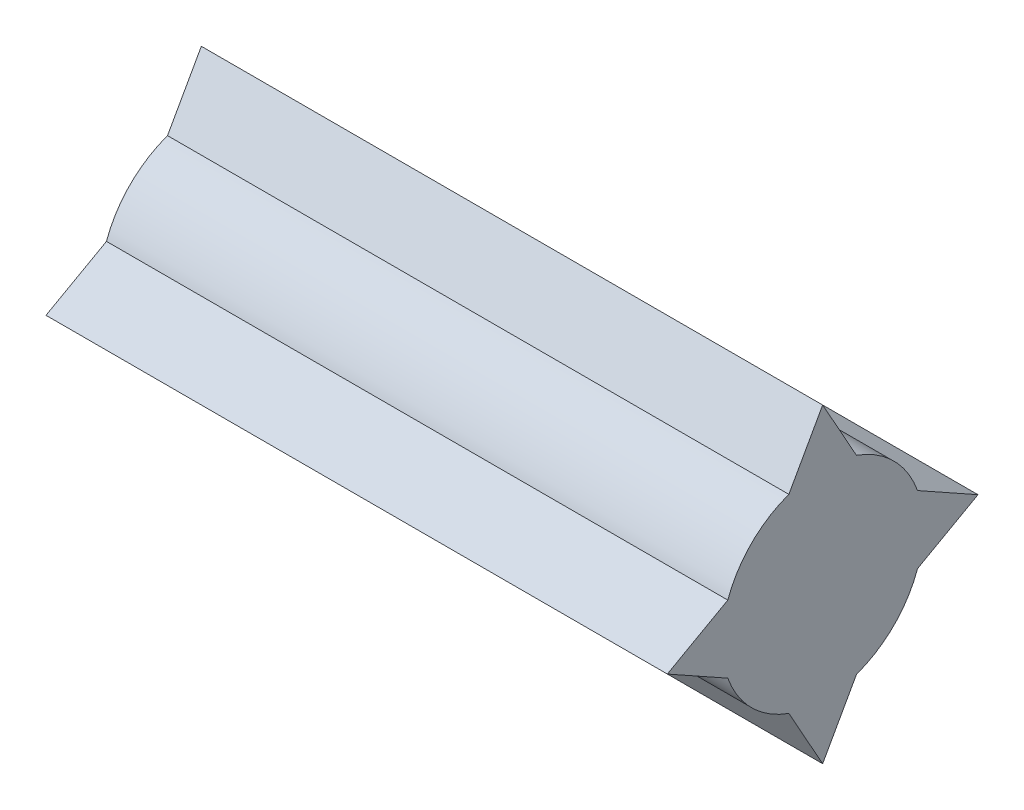
ISO-10303-21;
HEADER;
FILE_DESCRIPTION(('STEP AP214'),'2;1');
FILE_NAME('part.step','',(''),(''),'','','');
FILE_SCHEMA(('AUTOMOTIVE_DESIGN { 1 0 10303 214 1 1 1 1 }'));
ENDSEC;
DATA;
#1=APPLICATION_CONTEXT('core data for automotive mechanical design processes');
#2=APPLICATION_PROTOCOL_DEFINITION('international standard','automotive_design',2000,#1);
#3=PRODUCT_CONTEXT('',#1,'mechanical');
#4=PRODUCT('Part','Part','',(#3));
#5=PRODUCT_RELATED_PRODUCT_CATEGORY('part','',(#4));
#6=PRODUCT_DEFINITION_FORMATION('','',#4);
#7=PRODUCT_DEFINITION_CONTEXT('part definition',#1,'design');
#8=PRODUCT_DEFINITION('design','',#6,#7);
#9=PRODUCT_DEFINITION_SHAPE('','',#8);
#10=(LENGTH_UNIT() NAMED_UNIT(*) SI_UNIT(.MILLI.,.METRE.));
#11=(NAMED_UNIT(*) PLANE_ANGLE_UNIT() SI_UNIT($,.RADIAN.));
#12=(NAMED_UNIT(*) SI_UNIT($,.STERADIAN.) SOLID_ANGLE_UNIT());
#13=UNCERTAINTY_MEASURE_WITH_UNIT(LENGTH_MEASURE(1.E-05),#10,'distance_accuracy_value','');
#14=(GEOMETRIC_REPRESENTATION_CONTEXT(3) GLOBAL_UNCERTAINTY_ASSIGNED_CONTEXT((#13)) GLOBAL_UNIT_ASSIGNED_CONTEXT((#10,
#11,#12)) REPRESENTATION_CONTEXT('',''));
#15=CARTESIAN_POINT('',(0.,0.,0.));
#16=DIRECTION('',(0.,0.,1.));
#17=DIRECTION('',(1.,0.,0.));
#18=AXIS2_PLACEMENT_3D('',#15,#16,#17);
#19=CARTESIAN_POINT('',(15.,0.,0.));
#20=DIRECTION('',(1.,0.,0.));
#21=DIRECTION('',(0.,0.,-1.));
#22=AXIS2_PLACEMENT_3D('',#19,#20,#21);
#23=PLANE('',#22);
#24=CARTESIAN_POINT('',(15.,0.,0.));
#25=DIRECTION('',(1.,0.,0.));
#26=DIRECTION('',(0.,0.,-1.));
#27=AXIS2_PLACEMENT_3D('',#24,#25,#26);
#28=CIRCLE('',#27,4.8625);
#29=CARTESIAN_POINT('',(15.,-1.63235290016241,-4.58031988613583));
#30=VERTEX_POINT('',#29);
#31=CARTESIAN_POINT('',(15.,-4.58031988613585,-1.63235290016237));
#32=VERTEX_POINT('',#31);
#33=EDGE_CURVE('E36',#30,#32,#28,.F.);
#34=ORIENTED_EDGE('',*,*,#33,.F.);
#35=DIRECTION('',(0.,0.487996068424335,-0.87284582670847));
#36=VECTOR('',#35,1.);
#37=CARTESIAN_POINT('',(15.,0.,-7.49999999999954));
#38=LINE('',#37,#36);
#39=CARTESIAN_POINT('',(15.,0.,-7.49999999999954));
#40=VERTEX_POINT('',#39);
#41=EDGE_CURVE('E215',#30,#40,#38,.T.);
#42=ORIENTED_EDGE('',*,*,#41,.T.);
#43=DIRECTION('',(0.,0.487996068424338,0.872845826708468));
#44=VECTOR('',#43,1.);
#45=CARTESIAN_POINT('',(15.,0.,-7.49999999999954));
#46=LINE('',#45,#44);
#47=CARTESIAN_POINT('',(15.,1.63235290016236,-4.58031988613585));
#48=VERTEX_POINT('',#47);
#49=EDGE_CURVE('E201',#40,#48,#46,.T.);
#50=ORIENTED_EDGE('',*,*,#49,.T.);
#51=CARTESIAN_POINT('',(15.,4.58031988613584,-1.6323529001624));
#52=VERTEX_POINT('',#51);
#53=EDGE_CURVE('E152',#52,#48,#28,.F.);
#54=ORIENTED_EDGE('',*,*,#53,.F.);
#55=DIRECTION('',(0.,0.872845826708468,0.487996068424338));
#56=VECTOR('',#55,1.);
#57=CARTESIAN_POINT('',(15.,7.49999999999954,0.));
#58=LINE('',#57,#56);
#59=CARTESIAN_POINT('',(15.,7.49999999999954,0.));
#60=VERTEX_POINT('',#59);
#61=EDGE_CURVE('E205',#52,#60,#58,.T.);
#62=ORIENTED_EDGE('',*,*,#61,.T.);
#63=DIRECTION('',(0.,-0.872845826708468,0.487996068424338));
#64=VECTOR('',#63,1.);
#65=CARTESIAN_POINT('',(15.,7.49999999999954,0.));
#66=LINE('',#65,#64);
#67=CARTESIAN_POINT('',(15.,4.58031988613584,1.6323529001624));
#68=VERTEX_POINT('',#67);
#69=EDGE_CURVE('E98',#60,#68,#66,.T.);
#70=ORIENTED_EDGE('',*,*,#69,.T.);
#71=CARTESIAN_POINT('',(15.,1.63235290016236,4.58031988613585));
#72=VERTEX_POINT('',#71);
#73=EDGE_CURVE('E92',#72,#68,#28,.F.);
#74=ORIENTED_EDGE('',*,*,#73,.F.);
#75=DIRECTION('',(0.,-0.487996068424314,0.872845826708481));
#76=VECTOR('',#75,1.);
#77=CARTESIAN_POINT('',(15.,0.,7.49999999999954));
#78=LINE('',#77,#76);
#79=CARTESIAN_POINT('',(15.,0.,7.49999999999954));
#80=VERTEX_POINT('',#79);
#81=EDGE_CURVE('E174',#72,#80,#78,.T.);
#82=ORIENTED_EDGE('',*,*,#81,.T.);
#83=DIRECTION('',(0.,-0.487996068424347,-0.872845826708463));
#84=VECTOR('',#83,1.);
#85=CARTESIAN_POINT('',(15.,0.,7.49999999999954));
#86=LINE('',#85,#84);
#87=CARTESIAN_POINT('',(15.,-1.63235290016235,4.58031988613585));
#88=VERTEX_POINT('',#87);
#89=EDGE_CURVE('E172',#80,#88,#86,.T.);
#90=ORIENTED_EDGE('',*,*,#89,.T.);
#91=CARTESIAN_POINT('',(15.,-4.58031988613582,1.63235290016243));
#92=VERTEX_POINT('',#91);
#93=EDGE_CURVE('E159',#92,#88,#28,.F.);
#94=ORIENTED_EDGE('',*,*,#93,.F.);
#95=DIRECTION('',(0.,-0.87284582670846,-0.487996068424352));
#96=VECTOR('',#95,1.);
#97=CARTESIAN_POINT('',(15.,-7.49999999999948,0.));
#98=LINE('',#97,#96);
#99=CARTESIAN_POINT('',(15.,-7.49999999999948,0.));
#100=VERTEX_POINT('',#99);
#101=EDGE_CURVE('E178',#92,#100,#98,.T.);
#102=ORIENTED_EDGE('',*,*,#101,.T.);
#103=DIRECTION('',(0.,0.872845826708466,-0.487996068424341));
#104=VECTOR('',#103,1.);
#105=CARTESIAN_POINT('',(15.,-7.49999999999948,0.));
#106=LINE('',#105,#104);
#107=EDGE_CURVE('E217',#100,#32,#106,.T.);
#108=ORIENTED_EDGE('',*,*,#107,.T.);
#109=EDGE_LOOP('',(#34,#42,#50,#54,#62,#70,#74,#82,#90,#94,#102,#108));
#110=FACE_BOUND('',#109,.T.);
#111=ADVANCED_FACE('F32',(#110),#23,.T.);
#112=CARTESIAN_POINT('',(-15.,0.,0.));
#113=DIRECTION('',(-1.,0.,0.));
#114=DIRECTION('',(0.,0.,1.));
#115=AXIS2_PLACEMENT_3D('',#112,#113,#114);
#116=PLANE('',#115);
#117=CARTESIAN_POINT('',(-15.,0.,0.));
#118=DIRECTION('',(-1.,0.,0.));
#119=DIRECTION('',(0.,0.,1.));
#120=AXIS2_PLACEMENT_3D('',#117,#118,#119);
#121=CIRCLE('',#120,4.8625);
#122=CARTESIAN_POINT('',(-15.,-1.63235290016235,4.58031988613585));
#123=VERTEX_POINT('',#122);
#124=CARTESIAN_POINT('',(-15.,-4.58031988613583,1.63235290016243));
#125=VERTEX_POINT('',#124);
#126=EDGE_CURVE('E146',#123,#125,#121,.F.);
#127=ORIENTED_EDGE('',*,*,#126,.F.);
#128=DIRECTION('',(0.,-0.487996068424347,-0.872845826708463));
#129=VECTOR('',#128,1.);
#130=CARTESIAN_POINT('',(-15.,0.,7.49999999999954));
#131=LINE('',#130,#129);
#132=CARTESIAN_POINT('',(-15.,0.,7.49999999999954));
#133=VERTEX_POINT('',#132);
#134=EDGE_CURVE('E181',#133,#123,#131,.T.);
#135=ORIENTED_EDGE('',*,*,#134,.F.);
#136=DIRECTION('',(0.,-0.487996068424314,0.872845826708481));
#137=VECTOR('',#136,1.);
#138=CARTESIAN_POINT('',(-15.,0.,7.49999999999954));
#139=LINE('',#138,#137);
#140=CARTESIAN_POINT('',(-15.,1.63235290016236,4.58031988613585));
#141=VERTEX_POINT('',#140);
#142=EDGE_CURVE('E139',#141,#133,#139,.T.);
#143=ORIENTED_EDGE('',*,*,#142,.F.);
#144=CARTESIAN_POINT('',(-15.,4.58031988613584,1.6323529001624));
#145=VERTEX_POINT('',#144);
#146=EDGE_CURVE('E133',#145,#141,#121,.F.);
#147=ORIENTED_EDGE('',*,*,#146,.F.);
#148=DIRECTION('',(0.,-0.872845826708468,0.487996068424338));
#149=VECTOR('',#148,1.);
#150=CARTESIAN_POINT('',(-15.,7.49999999999954,0.));
#151=LINE('',#150,#149);
#152=CARTESIAN_POINT('',(-15.,7.49999999999954,0.));
#153=VERTEX_POINT('',#152);
#154=EDGE_CURVE('E42',#153,#145,#151,.T.);
#155=ORIENTED_EDGE('',*,*,#154,.F.);
#156=DIRECTION('',(0.,0.872845826708468,0.487996068424338));
#157=VECTOR('',#156,1.);
#158=CARTESIAN_POINT('',(-15.,7.49999999999954,0.));
#159=LINE('',#158,#157);
#160=CARTESIAN_POINT('',(-15.,4.58031988613584,-1.6323529001624));
#161=VERTEX_POINT('',#160);
#162=EDGE_CURVE('E11',#161,#153,#159,.T.);
#163=ORIENTED_EDGE('',*,*,#162,.F.);
#164=CARTESIAN_POINT('',(-15.,1.63235290016236,-4.58031988613585));
#165=VERTEX_POINT('',#164);
#166=EDGE_CURVE('E145',#165,#161,#121,.F.);
#167=ORIENTED_EDGE('',*,*,#166,.F.);
#168=DIRECTION('',(0.,0.487996068424338,0.872845826708468));
#169=VECTOR('',#168,1.);
#170=CARTESIAN_POINT('',(-15.,0.,-7.49999999999954));
#171=LINE('',#170,#169);
#172=CARTESIAN_POINT('',(-15.,0.,-7.49999999999954));
#173=VERTEX_POINT('',#172);
#174=EDGE_CURVE('E202',#173,#165,#171,.T.);
#175=ORIENTED_EDGE('',*,*,#174,.F.);
#176=DIRECTION('',(0.,0.487996068424335,-0.87284582670847));
#177=VECTOR('',#176,1.);
#178=CARTESIAN_POINT('',(-15.,0.,-7.49999999999954));
#179=LINE('',#178,#177);
#180=CARTESIAN_POINT('',(-15.,-1.63235290016241,-4.58031988613583));
#181=VERTEX_POINT('',#180);
#182=EDGE_CURVE('E106',#181,#173,#179,.T.);
#183=ORIENTED_EDGE('',*,*,#182,.F.);
#184=CARTESIAN_POINT('',(-15.,-4.58031988613585,-1.63235290016237));
#185=VERTEX_POINT('',#184);
#186=EDGE_CURVE('E149',#185,#181,#121,.F.);
#187=ORIENTED_EDGE('',*,*,#186,.F.);
#188=DIRECTION('',(0.,0.872845826708466,-0.487996068424341));
#189=VECTOR('',#188,1.);
#190=CARTESIAN_POINT('',(-15.,-7.49999999999948,0.));
#191=LINE('',#190,#189);
#192=CARTESIAN_POINT('',(-15.,-7.49999999999948,0.));
#193=VERTEX_POINT('',#192);
#194=EDGE_CURVE('E207',#193,#185,#191,.T.);
#195=ORIENTED_EDGE('',*,*,#194,.F.);
#196=DIRECTION('',(0.,-0.87284582670846,-0.487996068424352));
#197=VECTOR('',#196,1.);
#198=CARTESIAN_POINT('',(-15.,-7.49999999999948,0.));
#199=LINE('',#198,#197);
#200=EDGE_CURVE('E210',#125,#193,#199,.T.);
#201=ORIENTED_EDGE('',*,*,#200,.F.);
#202=EDGE_LOOP('',(#127,#135,#143,#147,#155,#163,#167,#175,#183,#187,#195,#201));
#203=FACE_BOUND('',#202,.T.);
#204=ADVANCED_FACE('F143',(#203),#116,.T.);
#205=CARTESIAN_POINT('',(-110.,0.,0.));
#206=DIRECTION('',(-1.,0.,0.));
#207=DIRECTION('',(0.,0.,1.));
#208=AXIS2_PLACEMENT_3D('',#205,#206,#207);
#209=CYLINDRICAL_SURFACE('',#208,4.8625);
#210=DIRECTION('',(-1.,0.,0.));
#211=VECTOR('',#210,1.);
#212=CARTESIAN_POINT('',(15.,-4.58031988613582,1.63235290016243));
#213=LINE('',#212,#211);
#214=EDGE_CURVE('E168',#92,#125,#213,.T.);
#215=ORIENTED_EDGE('',*,*,#214,.F.);
#216=ORIENTED_EDGE('',*,*,#93,.T.);
#217=DIRECTION('',(-1.,0.,0.));
#218=VECTOR('',#217,1.);
#219=CARTESIAN_POINT('',(15.,-1.63235290016235,4.58031988613585));
#220=LINE('',#219,#218);
#221=EDGE_CURVE('E166',#88,#123,#220,.T.);
#222=ORIENTED_EDGE('',*,*,#221,.T.);
#223=ORIENTED_EDGE('',*,*,#126,.T.);
#224=EDGE_LOOP('',(#215,#216,#222,#223));
#225=FACE_BOUND('',#224,.T.);
#226=ADVANCED_FACE('F164',(#225),#209,.T.);
#227=CARTESIAN_POINT('',(15.,-7.49999999999948,0.));
#228=DIRECTION('',(0.,0.487996068424352,-0.87284582670846));
#229=DIRECTION('',(0.,0.87284582670846,0.487996068424352));
#230=AXIS2_PLACEMENT_3D('',#227,#228,#229);
#231=PLANE('',#230);
#232=ORIENTED_EDGE('',*,*,#200,.T.);
#233=DIRECTION('',(-1.,0.,0.));
#234=VECTOR('',#233,1.);
#235=CARTESIAN_POINT('',(15.,-7.49999999999948,0.));
#236=LINE('',#235,#234);
#237=EDGE_CURVE('E184',#100,#193,#236,.T.);
#238=ORIENTED_EDGE('',*,*,#237,.F.);
#239=ORIENTED_EDGE('',*,*,#101,.F.);
#240=ORIENTED_EDGE('',*,*,#214,.T.);
#241=EDGE_LOOP('',(#232,#238,#239,#240));
#242=FACE_BOUND('',#241,.T.);
#243=ADVANCED_FACE('F240',(#242),#231,.F.);
#244=DIRECTION('',(-1.,0.,0.));
#245=VECTOR('',#244,1.);
#246=CARTESIAN_POINT('',(15.,-1.63235290016241,-4.58031988613583));
#247=LINE('',#246,#245);
#248=EDGE_CURVE('E193',#30,#181,#247,.T.);
#249=ORIENTED_EDGE('',*,*,#248,.F.);
#250=ORIENTED_EDGE('',*,*,#33,.T.);
#251=DIRECTION('',(-1.,0.,0.));
#252=VECTOR('',#251,1.);
#253=CARTESIAN_POINT('',(15.,-4.58031988613585,-1.63235290016237));
#254=LINE('',#253,#252);
#255=EDGE_CURVE('E191',#32,#185,#254,.T.);
#256=ORIENTED_EDGE('',*,*,#255,.T.);
#257=ORIENTED_EDGE('',*,*,#186,.T.);
#258=EDGE_LOOP('',(#249,#250,#256,#257));
#259=FACE_BOUND('',#258,.T.);
#260=ADVANCED_FACE('F34',(#259),#209,.T.);
#261=CARTESIAN_POINT('',(15.,-7.49999999999948,0.));
#262=DIRECTION('',(0.,0.487996068424341,0.872845826708466));
#263=DIRECTION('',(0.,-0.872845826708466,0.487996068424341));
#264=AXIS2_PLACEMENT_3D('',#261,#262,#263);
#265=PLANE('',#264);
#266=ORIENTED_EDGE('',*,*,#194,.T.);
#267=ORIENTED_EDGE('',*,*,#255,.F.);
#268=ORIENTED_EDGE('',*,*,#107,.F.);
#269=ORIENTED_EDGE('',*,*,#237,.T.);
#270=EDGE_LOOP('',(#266,#267,#268,#269));
#271=FACE_BOUND('',#270,.T.);
#272=ADVANCED_FACE('F236',(#271),#265,.F.);
#273=DIRECTION('',(-1.,0.,0.));
#274=VECTOR('',#273,1.);
#275=CARTESIAN_POINT('',(15.,1.63235290016236,4.58031988613585));
#276=LINE('',#275,#274);
#277=EDGE_CURVE('E134',#72,#141,#276,.T.);
#278=ORIENTED_EDGE('',*,*,#277,.F.);
#279=ORIENTED_EDGE('',*,*,#73,.T.);
#280=DIRECTION('',(-1.,0.,0.));
#281=VECTOR('',#280,1.);
#282=CARTESIAN_POINT('',(15.,4.58031988613584,1.6323529001624));
#283=LINE('',#282,#281);
#284=EDGE_CURVE('E131',#68,#145,#283,.T.);
#285=ORIENTED_EDGE('',*,*,#284,.T.);
#286=ORIENTED_EDGE('',*,*,#146,.T.);
#287=EDGE_LOOP('',(#278,#279,#285,#286));
#288=FACE_BOUND('',#287,.T.);
#289=ADVANCED_FACE('F132',(#288),#209,.T.);
#290=CARTESIAN_POINT('',(15.,0.,7.49999999999954));
#291=DIRECTION('',(0.,0.872845826708463,-0.487996068424347));
#292=DIRECTION('',(0.,0.487996068424347,0.872845826708463));
#293=AXIS2_PLACEMENT_3D('',#290,#291,#292);
#294=PLANE('',#293);
#295=ORIENTED_EDGE('',*,*,#134,.T.);
#296=ORIENTED_EDGE('',*,*,#221,.F.);
#297=ORIENTED_EDGE('',*,*,#89,.F.);
#298=DIRECTION('',(-1.,0.,0.));
#299=VECTOR('',#298,1.);
#300=CARTESIAN_POINT('',(15.,0.,7.49999999999954));
#301=LINE('',#300,#299);
#302=EDGE_CURVE('E182',#80,#133,#301,.T.);
#303=ORIENTED_EDGE('',*,*,#302,.T.);
#304=EDGE_LOOP('',(#295,#296,#297,#303));
#305=FACE_BOUND('',#304,.T.);
#306=ADVANCED_FACE('F180',(#305),#294,.F.);
#307=CARTESIAN_POINT('',(15.,0.,7.49999999999954));
#308=DIRECTION('',(0.,-0.872845826708481,-0.487996068424314));
#309=DIRECTION('',(0.,0.487996068424314,-0.872845826708482));
#310=AXIS2_PLACEMENT_3D('',#307,#308,#309);
#311=PLANE('',#310);
#312=ORIENTED_EDGE('',*,*,#142,.T.);
#313=ORIENTED_EDGE('',*,*,#302,.F.);
#314=ORIENTED_EDGE('',*,*,#81,.F.);
#315=ORIENTED_EDGE('',*,*,#277,.T.);
#316=EDGE_LOOP('',(#312,#313,#314,#315));
#317=FACE_BOUND('',#316,.T.);
#318=ADVANCED_FACE('F267',(#317),#311,.F.);
#319=DIRECTION('',(-1.,0.,0.));
#320=VECTOR('',#319,1.);
#321=CARTESIAN_POINT('',(15.,4.58031988613584,-1.6323529001624));
#322=LINE('',#321,#320);
#323=EDGE_CURVE('E199',#52,#161,#322,.T.);
#324=ORIENTED_EDGE('',*,*,#323,.F.);
#325=ORIENTED_EDGE('',*,*,#53,.T.);
#326=DIRECTION('',(-1.,0.,0.));
#327=VECTOR('',#326,1.);
#328=CARTESIAN_POINT('',(15.,1.63235290016236,-4.58031988613585));
#329=LINE('',#328,#327);
#330=EDGE_CURVE('E197',#48,#165,#329,.T.);
#331=ORIENTED_EDGE('',*,*,#330,.T.);
#332=ORIENTED_EDGE('',*,*,#166,.T.);
#333=EDGE_LOOP('',(#324,#325,#331,#332));
#334=FACE_BOUND('',#333,.T.);
#335=ADVANCED_FACE('F226',(#334),#209,.T.);
#336=CARTESIAN_POINT('',(15.,7.49999999999954,0.));
#337=DIRECTION('',(0.,-0.487996068424338,-0.872845826708468));
#338=DIRECTION('',(0.,0.872845826708468,-0.487996068424338));
#339=AXIS2_PLACEMENT_3D('',#336,#337,#338);
#340=PLANE('',#339);
#341=ORIENTED_EDGE('',*,*,#154,.T.);
#342=ORIENTED_EDGE('',*,*,#284,.F.);
#343=ORIENTED_EDGE('',*,*,#69,.F.);
#344=DIRECTION('',(-1.,0.,0.));
#345=VECTOR('',#344,1.);
#346=CARTESIAN_POINT('',(15.,7.49999999999954,0.));
#347=LINE('',#346,#345);
#348=EDGE_CURVE('E135',#60,#153,#347,.T.);
#349=ORIENTED_EDGE('',*,*,#348,.T.);
#350=EDGE_LOOP('',(#341,#342,#343,#349));
#351=FACE_BOUND('',#350,.T.);
#352=ADVANCED_FACE('F137',(#351),#340,.F.);
#353=CARTESIAN_POINT('',(15.,7.49999999999954,0.));
#354=DIRECTION('',(0.,-0.487996068424338,0.872845826708468));
#355=DIRECTION('',(0.,-0.872845826708468,-0.487996068424338));
#356=AXIS2_PLACEMENT_3D('',#353,#354,#355);
#357=PLANE('',#356);
#358=ORIENTED_EDGE('',*,*,#162,.T.);
#359=ORIENTED_EDGE('',*,*,#348,.F.);
#360=ORIENTED_EDGE('',*,*,#61,.F.);
#361=ORIENTED_EDGE('',*,*,#323,.T.);
#362=EDGE_LOOP('',(#358,#359,#360,#361));
#363=FACE_BOUND('',#362,.T.);
#364=ADVANCED_FACE('F223',(#363),#357,.F.);
#365=CARTESIAN_POINT('',(15.,0.,-7.49999999999954));
#366=DIRECTION('',(0.,-0.872845826708468,0.487996068424338));
#367=DIRECTION('',(0.,-0.487996068424338,-0.872845826708468));
#368=AXIS2_PLACEMENT_3D('',#365,#366,#367);
#369=PLANE('',#368);
#370=ORIENTED_EDGE('',*,*,#174,.T.);
#371=ORIENTED_EDGE('',*,*,#330,.F.);
#372=ORIENTED_EDGE('',*,*,#49,.F.);
#373=DIRECTION('',(-1.,0.,0.));
#374=VECTOR('',#373,1.);
#375=CARTESIAN_POINT('',(15.,0.,-7.49999999999954));
#376=LINE('',#375,#374);
#377=EDGE_CURVE('E195',#40,#173,#376,.T.);
#378=ORIENTED_EDGE('',*,*,#377,.T.);
#379=EDGE_LOOP('',(#370,#371,#372,#378));
#380=FACE_BOUND('',#379,.T.);
#381=ADVANCED_FACE('F230',(#380),#369,.F.);
#382=CARTESIAN_POINT('',(15.,0.,-7.49999999999954));
#383=DIRECTION('',(0.,0.87284582670847,0.487996068424335));
#384=DIRECTION('',(0.,-0.487996068424335,0.87284582670847));
#385=AXIS2_PLACEMENT_3D('',#382,#383,#384);
#386=PLANE('',#385);
#387=ORIENTED_EDGE('',*,*,#182,.T.);
#388=ORIENTED_EDGE('',*,*,#377,.F.);
#389=ORIENTED_EDGE('',*,*,#41,.F.);
#390=ORIENTED_EDGE('',*,*,#248,.T.);
#391=EDGE_LOOP('',(#387,#388,#389,#390));
#392=FACE_BOUND('',#391,.T.);
#393=ADVANCED_FACE('F242',(#392),#386,.F.);
#394=CLOSED_SHELL('',(#111,#204,#226,#243,#260,#272,#289,#306,#318,#335,#352,#364,#381,#393));
#395=MANIFOLD_SOLID_BREP('B2',#394);
#396=ADVANCED_BREP_SHAPE_REPRESENTATION('',(#18,#395),#14);
#397=SHAPE_DEFINITION_REPRESENTATION(#9,#396);
ENDSEC;
END-ISO-10303-21;
